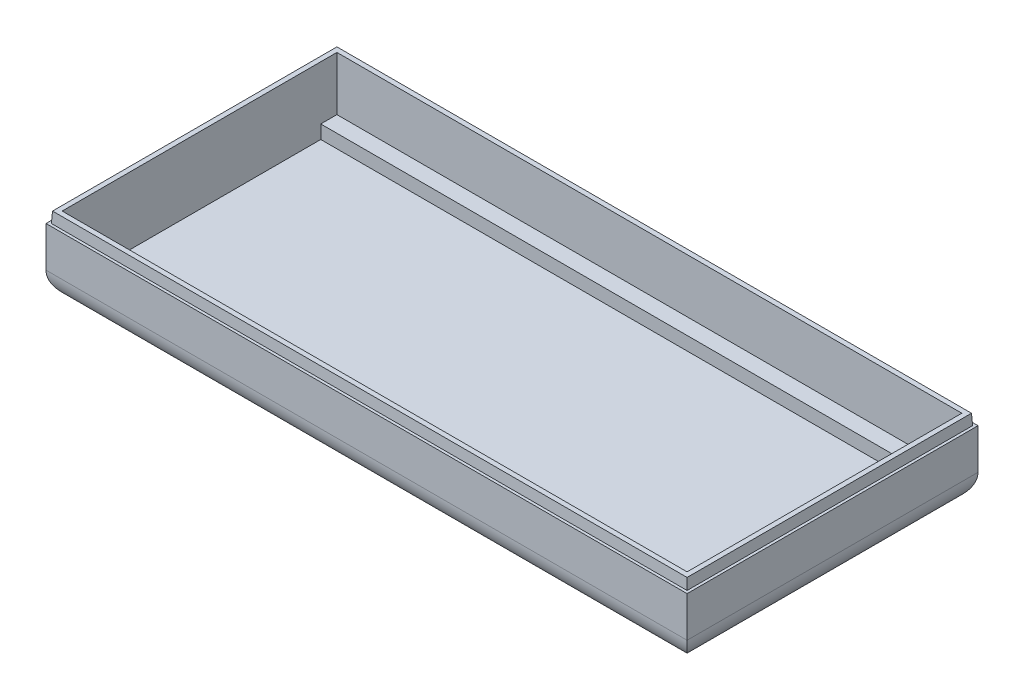
ISO-10303-21;
HEADER;
FILE_DESCRIPTION(('STEP AP214'),'2;1');
FILE_NAME('part.step','',(''),(''),'','','');
FILE_SCHEMA(('AUTOMOTIVE_DESIGN { 1 0 10303 214 1 1 1 1 }'));
ENDSEC;
DATA;
#1=APPLICATION_CONTEXT('core data for automotive mechanical design processes');
#2=APPLICATION_PROTOCOL_DEFINITION('international standard','automotive_design',2000,#1);
#3=PRODUCT_CONTEXT('',#1,'mechanical');
#4=PRODUCT('Part','Part','',(#3));
#5=PRODUCT_RELATED_PRODUCT_CATEGORY('part','',(#4));
#6=PRODUCT_DEFINITION_FORMATION('','',#4);
#7=PRODUCT_DEFINITION_CONTEXT('part definition',#1,'design');
#8=PRODUCT_DEFINITION('design','',#6,#7);
#9=PRODUCT_DEFINITION_SHAPE('','',#8);
#10=(LENGTH_UNIT() NAMED_UNIT(*) SI_UNIT(.MILLI.,.METRE.));
#11=(NAMED_UNIT(*) PLANE_ANGLE_UNIT() SI_UNIT($,.RADIAN.));
#12=(NAMED_UNIT(*) SI_UNIT($,.STERADIAN.) SOLID_ANGLE_UNIT());
#13=UNCERTAINTY_MEASURE_WITH_UNIT(LENGTH_MEASURE(1.E-05),#10,'distance_accuracy_value','');
#14=(GEOMETRIC_REPRESENTATION_CONTEXT(3) GLOBAL_UNCERTAINTY_ASSIGNED_CONTEXT((#13)) GLOBAL_UNIT_ASSIGNED_CONTEXT((#10,
#11,#12)) REPRESENTATION_CONTEXT('',''));
#15=CARTESIAN_POINT('',(0.,0.,0.));
#16=DIRECTION('',(0.,0.,1.));
#17=DIRECTION('',(1.,0.,0.));
#18=AXIS2_PLACEMENT_3D('',#15,#16,#17);
#19=CARTESIAN_POINT('',(0.,0.5,-3.));
#20=DIRECTION('',(1.,0.,0.));
#21=DIRECTION('',(0.,0.,-1.));
#22=AXIS2_PLACEMENT_3D('',#19,#20,#21);
#23=CYLINDRICAL_SURFACE('',#22,5.);
#24=CARTESIAN_POINT('',(112.,0.5,-3.00000000000001));
#25=DIRECTION('',(0.707106781186547,0.,-0.707106781186547));
#26=DIRECTION('',(-0.707106781186548,0.,-0.707106781186547));
#27=AXIS2_PLACEMENT_3D('',#24,#25,#26);
#28=ELLIPSE('',#27,7.07106781186547,5.);
#29=CARTESIAN_POINT('',(117.,0.500000000000001,1.99999999999999));
#30=VERTEX_POINT('',#29);
#31=CARTESIAN_POINT('',(112.,-4.5,-3.00000000000001));
#32=VERTEX_POINT('',#31);
#33=EDGE_CURVE('E12',#30,#32,#28,.T.);
#34=ORIENTED_EDGE('',*,*,#33,.F.);
#35=DIRECTION('',(1.,0.,0.));
#36=VECTOR('',#35,1.);
#37=CARTESIAN_POINT('',(0.,0.5,2.));
#38=LINE('',#37,#36);
#39=CARTESIAN_POINT('',(-1.99999999999999,0.500000000000001,2.));
#40=VERTEX_POINT('',#39);
#41=EDGE_CURVE('E312',#40,#30,#38,.T.);
#42=ORIENTED_EDGE('',*,*,#41,.F.);
#43=CARTESIAN_POINT('',(3.00000000000001,0.5,-3.));
#44=DIRECTION('',(0.707106781186548,0.,0.707106781186547));
#45=DIRECTION('',(0.707106781186547,0.,-0.707106781186548));
#46=AXIS2_PLACEMENT_3D('',#43,#44,#45);
#47=ELLIPSE('',#46,7.07106781186547,5.);
#48=CARTESIAN_POINT('',(3.00000000000001,-4.5,-3.));
#49=VERTEX_POINT('',#48);
#50=EDGE_CURVE('E46',#40,#49,#47,.T.);
#51=ORIENTED_EDGE('',*,*,#50,.T.);
#52=DIRECTION('',(1.,0.,0.));
#53=VECTOR('',#52,1.);
#54=CARTESIAN_POINT('',(0.,-4.5,-3.));
#55=LINE('',#54,#53);
#56=EDGE_CURVE('E294',#32,#49,#55,.F.);
#57=ORIENTED_EDGE('',*,*,#56,.F.);
#58=EDGE_LOOP('',(#34,#42,#51,#57));
#59=FACE_BOUND('',#58,.T.);
#60=ADVANCED_FACE('F39',(#59),#23,.T.);
#61=CARTESIAN_POINT('',(3.00000000000001,0.5,0.));
#62=DIRECTION('',(0.,0.,1.));
#63=DIRECTION('',(1.,0.,0.));
#64=AXIS2_PLACEMENT_3D('',#61,#62,#63);
#65=CYLINDRICAL_SURFACE('',#64,5.);
#66=ORIENTED_EDGE('',*,*,#50,.F.);
#67=DIRECTION('',(0.,0.,1.));
#68=VECTOR('',#67,1.);
#69=CARTESIAN_POINT('',(-1.99999999999999,0.5,0.));
#70=LINE('',#69,#68);
#71=CARTESIAN_POINT('',(-2.,0.500000000000001,-52.));
#72=VERTEX_POINT('',#71);
#73=EDGE_CURVE('E309',#72,#40,#70,.T.);
#74=ORIENTED_EDGE('',*,*,#73,.F.);
#75=CARTESIAN_POINT('',(3.,0.5,-47.));
#76=DIRECTION('',(-0.707106781186547,0.,0.707106781186548));
#77=DIRECTION('',(0.707106781186548,0.,0.707106781186547));
#78=AXIS2_PLACEMENT_3D('',#75,#76,#77);
#79=ELLIPSE('',#78,7.07106781186547,5.);
#80=CARTESIAN_POINT('',(3.,-4.5,-47.));
#81=VERTEX_POINT('',#80);
#82=EDGE_CURVE('E60',#72,#81,#79,.T.);
#83=ORIENTED_EDGE('',*,*,#82,.T.);
#84=DIRECTION('',(0.,0.,1.));
#85=VECTOR('',#84,1.);
#86=CARTESIAN_POINT('',(3.00000000000001,-4.5,0.));
#87=LINE('',#86,#85);
#88=EDGE_CURVE('E297',#49,#81,#87,.F.);
#89=ORIENTED_EDGE('',*,*,#88,.F.);
#90=EDGE_LOOP('',(#66,#74,#83,#89));
#91=FACE_BOUND('',#90,.T.);
#92=ADVANCED_FACE('F319',(#91),#65,.T.);
#93=CARTESIAN_POINT('',(0.,0.5,-47.));
#94=DIRECTION('',(-1.,0.,0.));
#95=DIRECTION('',(0.,0.,1.));
#96=AXIS2_PLACEMENT_3D('',#93,#94,#95);
#97=CYLINDRICAL_SURFACE('',#96,5.);
#98=ORIENTED_EDGE('',*,*,#82,.F.);
#99=DIRECTION('',(-1.,0.,0.));
#100=VECTOR('',#99,1.);
#101=CARTESIAN_POINT('',(0.,0.5,-52.));
#102=LINE('',#101,#100);
#103=CARTESIAN_POINT('',(117.,0.500000000000001,-52.));
#104=VERTEX_POINT('',#103);
#105=EDGE_CURVE('E306',#104,#72,#102,.T.);
#106=ORIENTED_EDGE('',*,*,#105,.F.);
#107=CARTESIAN_POINT('',(112.,0.5,-47.));
#108=DIRECTION('',(-0.707106781186548,0.,-0.707106781186547));
#109=DIRECTION('',(-0.707106781186547,0.,0.707106781186548));
#110=AXIS2_PLACEMENT_3D('',#107,#108,#109);
#111=ELLIPSE('',#110,7.07106781186548,5.);
#112=CARTESIAN_POINT('',(112.,-4.5,-47.));
#113=VERTEX_POINT('',#112);
#114=EDGE_CURVE('E315',#104,#113,#111,.T.);
#115=ORIENTED_EDGE('',*,*,#114,.T.);
#116=DIRECTION('',(-1.,0.,0.));
#117=VECTOR('',#116,1.);
#118=CARTESIAN_POINT('',(0.,-4.5,-47.));
#119=LINE('',#118,#117);
#120=EDGE_CURVE('E300',#81,#113,#119,.F.);
#121=ORIENTED_EDGE('',*,*,#120,.F.);
#122=EDGE_LOOP('',(#98,#106,#115,#121));
#123=FACE_BOUND('',#122,.T.);
#124=ADVANCED_FACE('F342',(#123),#97,.T.);
#125=CARTESIAN_POINT('',(112.,0.5,0.));
#126=DIRECTION('',(0.,0.,-1.));
#127=DIRECTION('',(-1.,0.,0.));
#128=AXIS2_PLACEMENT_3D('',#125,#126,#127);
#129=CYLINDRICAL_SURFACE('',#128,5.);
#130=DIRECTION('',(0.,0.,-1.));
#131=VECTOR('',#130,1.);
#132=CARTESIAN_POINT('',(117.,0.5,0.));
#133=LINE('',#132,#131);
#134=EDGE_CURVE('E291',#30,#104,#133,.T.);
#135=ORIENTED_EDGE('',*,*,#134,.F.);
#136=ORIENTED_EDGE('',*,*,#33,.T.);
#137=DIRECTION('',(0.,0.,-1.));
#138=VECTOR('',#137,1.);
#139=CARTESIAN_POINT('',(112.,-4.5,0.));
#140=LINE('',#139,#138);
#141=EDGE_CURVE('E303',#113,#32,#140,.F.);
#142=ORIENTED_EDGE('',*,*,#141,.F.);
#143=ORIENTED_EDGE('',*,*,#114,.F.);
#144=EDGE_LOOP('',(#135,#136,#142,#143));
#145=FACE_BOUND('',#144,.T.);
#146=ADVANCED_FACE('F325',(#145),#129,.T.);
#147=CARTESIAN_POINT('',(0.,-2.5,2.));
#148=DIRECTION('',(0.,0.,1.));
#149=DIRECTION('',(1.,0.,0.));
#150=AXIS2_PLACEMENT_3D('',#147,#148,#149);
#151=PLANE('',#150);
#152=DIRECTION('',(0.,1.,0.));
#153=VECTOR('',#152,1.);
#154=CARTESIAN_POINT('',(-1.99999999999999,-2.5,2.));
#155=LINE('',#154,#153);
#156=CARTESIAN_POINT('',(-1.99999999999999,8.,2.));
#157=VERTEX_POINT('',#156);
#158=EDGE_CURVE('E277',#40,#157,#155,.T.);
#159=ORIENTED_EDGE('',*,*,#158,.F.);
#160=ORIENTED_EDGE('',*,*,#41,.T.);
#161=DIRECTION('',(0.,1.,0.));
#162=VECTOR('',#161,1.);
#163=CARTESIAN_POINT('',(117.,-2.5,1.99999999999999));
#164=LINE('',#163,#162);
#165=CARTESIAN_POINT('',(117.,8.,1.99999999999999));
#166=VERTEX_POINT('',#165);
#167=EDGE_CURVE('E171',#30,#166,#164,.T.);
#168=ORIENTED_EDGE('',*,*,#167,.T.);
#169=DIRECTION('',(1.,0.,0.));
#170=VECTOR('',#169,1.);
#171=CARTESIAN_POINT('',(0.,8.,2.));
#172=LINE('',#171,#170);
#173=EDGE_CURVE('E260',#157,#166,#172,.T.);
#174=ORIENTED_EDGE('',*,*,#173,.F.);
#175=EDGE_LOOP('',(#159,#160,#168,#174));
#176=FACE_BOUND('',#175,.T.);
#177=ADVANCED_FACE('F329',(#176),#151,.T.);
#178=CARTESIAN_POINT('',(-1.99999999999999,-2.5,0.));
#179=DIRECTION('',(-1.,0.,0.));
#180=DIRECTION('',(0.,0.,1.));
#181=AXIS2_PLACEMENT_3D('',#178,#179,#180);
#182=PLANE('',#181);
#183=DIRECTION('',(0.,1.,0.));
#184=VECTOR('',#183,1.);
#185=CARTESIAN_POINT('',(-2.,-2.5,-52.));
#186=LINE('',#185,#184);
#187=CARTESIAN_POINT('',(-2.,8.,-52.));
#188=VERTEX_POINT('',#187);
#189=EDGE_CURVE('E280',#72,#188,#186,.T.);
#190=ORIENTED_EDGE('',*,*,#189,.F.);
#191=ORIENTED_EDGE('',*,*,#73,.T.);
#192=ORIENTED_EDGE('',*,*,#158,.T.);
#193=DIRECTION('',(0.,0.,1.));
#194=VECTOR('',#193,1.);
#195=CARTESIAN_POINT('',(-1.99999999999999,8.,0.));
#196=LINE('',#195,#194);
#197=EDGE_CURVE('E269',#188,#157,#196,.T.);
#198=ORIENTED_EDGE('',*,*,#197,.F.);
#199=EDGE_LOOP('',(#190,#191,#192,#198));
#200=FACE_BOUND('',#199,.T.);
#201=ADVANCED_FACE('F335',(#200),#182,.T.);
#202=CARTESIAN_POINT('',(0.,-2.5,-52.));
#203=DIRECTION('',(0.,0.,-1.));
#204=DIRECTION('',(-1.,0.,0.));
#205=AXIS2_PLACEMENT_3D('',#202,#203,#204);
#206=PLANE('',#205);
#207=DIRECTION('',(0.,1.,0.));
#208=VECTOR('',#207,1.);
#209=CARTESIAN_POINT('',(117.,-2.5,-52.));
#210=LINE('',#209,#208);
#211=CARTESIAN_POINT('',(117.,8.,-52.));
#212=VERTEX_POINT('',#211);
#213=EDGE_CURVE('E282',#104,#212,#210,.T.);
#214=ORIENTED_EDGE('',*,*,#213,.F.);
#215=ORIENTED_EDGE('',*,*,#105,.T.);
#216=ORIENTED_EDGE('',*,*,#189,.T.);
#217=DIRECTION('',(-1.,0.,0.));
#218=VECTOR('',#217,1.);
#219=CARTESIAN_POINT('',(0.,8.,-52.));
#220=LINE('',#219,#218);
#221=EDGE_CURVE('E266',#212,#188,#220,.T.);
#222=ORIENTED_EDGE('',*,*,#221,.F.);
#223=EDGE_LOOP('',(#214,#215,#216,#222));
#224=FACE_BOUND('',#223,.T.);
#225=ADVANCED_FACE('F341',(#224),#206,.T.);
#226=CARTESIAN_POINT('',(117.,-2.5,0.));
#227=DIRECTION('',(1.,0.,0.));
#228=DIRECTION('',(0.,0.,-1.));
#229=AXIS2_PLACEMENT_3D('',#226,#227,#228);
#230=PLANE('',#229);
#231=ORIENTED_EDGE('',*,*,#167,.F.);
#232=ORIENTED_EDGE('',*,*,#134,.T.);
#233=ORIENTED_EDGE('',*,*,#213,.T.);
#234=DIRECTION('',(0.,0.,-1.));
#235=VECTOR('',#234,1.);
#236=CARTESIAN_POINT('',(117.,8.,0.));
#237=LINE('',#236,#235);
#238=EDGE_CURVE('E263',#166,#212,#237,.T.);
#239=ORIENTED_EDGE('',*,*,#238,.F.);
#240=EDGE_LOOP('',(#231,#232,#233,#239));
#241=FACE_BOUND('',#240,.T.);
#242=ADVANCED_FACE('F344',(#241),#230,.T.);
#243=CARTESIAN_POINT('',(0.,8.,0.));
#244=DIRECTION('',(0.,1.,0.));
#245=DIRECTION('',(0.,0.,1.));
#246=AXIS2_PLACEMENT_3D('',#243,#244,#245);
#247=PLANE('',#246);
#248=DIRECTION('',(0.,0.,1.));
#249=VECTOR('',#248,1.);
#250=CARTESIAN_POINT('',(116.5,8.,0.));
#251=LINE('',#250,#249);
#252=CARTESIAN_POINT('',(116.5,8.,-51.5));
#253=VERTEX_POINT('',#252);
#254=CARTESIAN_POINT('',(116.5,8.,1.5));
#255=VERTEX_POINT('',#254);
#256=EDGE_CURVE('E201',#253,#255,#251,.T.);
#257=ORIENTED_EDGE('',*,*,#256,.T.);
#258=DIRECTION('',(-1.,0.,0.));
#259=VECTOR('',#258,1.);
#260=CARTESIAN_POINT('',(0.,8.,1.5));
#261=LINE('',#260,#259);
#262=CARTESIAN_POINT('',(-1.5,8.,1.5));
#263=VERTEX_POINT('',#262);
#264=EDGE_CURVE('E197',#255,#263,#261,.T.);
#265=ORIENTED_EDGE('',*,*,#264,.T.);
#266=DIRECTION('',(0.,0.,-1.));
#267=VECTOR('',#266,1.);
#268=CARTESIAN_POINT('',(-1.5,8.,0.));
#269=LINE('',#268,#267);
#270=CARTESIAN_POINT('',(-1.5,8.,-51.5));
#271=VERTEX_POINT('',#270);
#272=EDGE_CURVE('E203',#263,#271,#269,.T.);
#273=ORIENTED_EDGE('',*,*,#272,.T.);
#274=DIRECTION('',(1.,0.,0.));
#275=VECTOR('',#274,1.);
#276=CARTESIAN_POINT('',(0.,8.,-51.5));
#277=LINE('',#276,#275);
#278=EDGE_CURVE('E200',#271,#253,#277,.T.);
#279=ORIENTED_EDGE('',*,*,#278,.T.);
#280=EDGE_LOOP('',(#257,#265,#273,#279));
#281=FACE_BOUND('',#280,.T.);
#282=ORIENTED_EDGE('',*,*,#173,.T.);
#283=ORIENTED_EDGE('',*,*,#238,.T.);
#284=ORIENTED_EDGE('',*,*,#221,.T.);
#285=ORIENTED_EDGE('',*,*,#197,.T.);
#286=EDGE_LOOP('',(#282,#283,#284,#285));
#287=FACE_BOUND('',#286,.T.);
#288=ADVANCED_FACE('F337',(#281,#287),#247,.T.);
#289=CARTESIAN_POINT('',(0.,-4.5,0.));
#290=DIRECTION('',(0.,-1.,0.));
#291=DIRECTION('',(0.,0.,-1.));
#292=AXIS2_PLACEMENT_3D('',#289,#290,#291);
#293=PLANE('',#292);
#294=ORIENTED_EDGE('',*,*,#120,.T.);
#295=ORIENTED_EDGE('',*,*,#141,.T.);
#296=ORIENTED_EDGE('',*,*,#56,.T.);
#297=ORIENTED_EDGE('',*,*,#88,.T.);
#298=EDGE_LOOP('',(#294,#295,#296,#297));
#299=FACE_BOUND('',#298,.T.);
#300=ADVANCED_FACE('F321',(#299),#293,.T.);
#301=CARTESIAN_POINT('',(116.5,8.,0.));
#302=DIRECTION('',(0.998629534754574,0.0523359562429438,0.));
#303=DIRECTION('',(-0.0523359562429438,0.998629534754574,0.));
#304=AXIS2_PLACEMENT_3D('',#301,#302,#303);
#305=PLANE('',#304);
#306=ORIENTED_EDGE('',*,*,#256,.F.);
#307=DIRECTION('',(0.0522644276887139,-0.997264688634237,-0.0522644276887139));
#308=VECTOR('',#307,1.);
#309=CARTESIAN_POINT('',(116.18177204821,14.0721510459561,-51.1817720482102));
#310=LINE('',#309,#308);
#311=CARTESIAN_POINT('',(116.395184441434,10.,-51.3951844414339));
#312=VERTEX_POINT('',#311);
#313=EDGE_CURVE('E209',#312,#253,#310,.T.);
#314=ORIENTED_EDGE('',*,*,#313,.F.);
#315=DIRECTION('',(0.,0.,1.));
#316=VECTOR('',#315,1.);
#317=CARTESIAN_POINT('',(116.395184441434,10.,0.));
#318=LINE('',#317,#316);
#319=CARTESIAN_POINT('',(116.395184441434,10.,1.39518444143392));
#320=VERTEX_POINT('',#319);
#321=EDGE_CURVE('E217',#312,#320,#318,.T.);
#322=ORIENTED_EDGE('',*,*,#321,.T.);
#323=DIRECTION('',(0.0522644276887139,-0.997264688634237,0.0522644276887139));
#324=VECTOR('',#323,1.);
#325=CARTESIAN_POINT('',(116.495902644398,8.07818220230845,1.49590264439756));
#326=LINE('',#325,#324);
#327=EDGE_CURVE('E188',#320,#255,#326,.T.);
#328=ORIENTED_EDGE('',*,*,#327,.T.);
#329=EDGE_LOOP('',(#306,#314,#322,#328));
#330=FACE_BOUND('',#329,.T.);
#331=ADVANCED_FACE('F399',(#330),#305,.T.);
#332=CARTESIAN_POINT('',(0.,8.,-51.5));
#333=DIRECTION('',(0.,0.0523359562429438,-0.998629534754574));
#334=DIRECTION('',(0.,0.998629534754574,0.0523359562429438));
#335=AXIS2_PLACEMENT_3D('',#332,#333,#334);
#336=PLANE('',#335);
#337=ORIENTED_EDGE('',*,*,#278,.F.);
#338=DIRECTION('',(-0.0522644276887139,-0.997264688634237,-0.0522644276887139));
#339=VECTOR('',#338,1.);
#340=CARTESIAN_POINT('',(-1.35932412431612,10.68425561259,-51.3593241243161));
#341=LINE('',#340,#339);
#342=CARTESIAN_POINT('',(-1.39518444143392,10.,-51.3951844414339));
#343=VERTEX_POINT('',#342);
#344=EDGE_CURVE('E208',#343,#271,#341,.T.);
#345=ORIENTED_EDGE('',*,*,#344,.F.);
#346=DIRECTION('',(1.,0.,0.));
#347=VECTOR('',#346,1.);
#348=CARTESIAN_POINT('',(0.,10.,-51.3951844414339));
#349=LINE('',#348,#347);
#350=EDGE_CURVE('E216',#343,#312,#349,.T.);
#351=ORIENTED_EDGE('',*,*,#350,.T.);
#352=ORIENTED_EDGE('',*,*,#313,.T.);
#353=EDGE_LOOP('',(#337,#345,#351,#352));
#354=FACE_BOUND('',#353,.T.);
#355=ADVANCED_FACE('F418',(#354),#336,.T.);
#356=CARTESIAN_POINT('',(-1.5,8.,0.));
#357=DIRECTION('',(-0.998629534754574,0.0523359562429438,0.));
#358=DIRECTION('',(-0.0523359562429438,-0.998629534754574,0.));
#359=AXIS2_PLACEMENT_3D('',#356,#357,#358);
#360=PLANE('',#359);
#361=ORIENTED_EDGE('',*,*,#272,.F.);
#362=DIRECTION('',(-0.0522644276887139,-0.997264688634237,0.0522644276887139));
#363=VECTOR('',#362,1.);
#364=CARTESIAN_POINT('',(-1.49590264439756,8.07818220230845,1.49590264439756));
#365=LINE('',#364,#363);
#366=CARTESIAN_POINT('',(-1.39518444143392,10.,1.39518444143392));
#367=VERTEX_POINT('',#366);
#368=EDGE_CURVE('E192',#367,#263,#365,.T.);
#369=ORIENTED_EDGE('',*,*,#368,.F.);
#370=DIRECTION('',(0.,0.,-1.));
#371=VECTOR('',#370,1.);
#372=CARTESIAN_POINT('',(-1.39518444143392,10.,0.));
#373=LINE('',#372,#371);
#374=EDGE_CURVE('E199',#367,#343,#373,.T.);
#375=ORIENTED_EDGE('',*,*,#374,.T.);
#376=ORIENTED_EDGE('',*,*,#344,.T.);
#377=EDGE_LOOP('',(#361,#369,#375,#376));
#378=FACE_BOUND('',#377,.T.);
#379=ADVANCED_FACE('F414',(#378),#360,.T.);
#380=CARTESIAN_POINT('',(0.,8.,1.5));
#381=DIRECTION('',(0.,0.0523359562429438,0.998629534754574));
#382=DIRECTION('',(0.,-0.998629534754574,0.0523359562429438));
#383=AXIS2_PLACEMENT_3D('',#380,#381,#382);
#384=PLANE('',#383);
#385=ORIENTED_EDGE('',*,*,#264,.F.);
#386=ORIENTED_EDGE('',*,*,#327,.F.);
#387=DIRECTION('',(-1.,0.,0.));
#388=VECTOR('',#387,1.);
#389=CARTESIAN_POINT('',(0.,10.,1.39518444143392));
#390=LINE('',#389,#388);
#391=EDGE_CURVE('E182',#320,#367,#390,.T.);
#392=ORIENTED_EDGE('',*,*,#391,.T.);
#393=ORIENTED_EDGE('',*,*,#368,.T.);
#394=EDGE_LOOP('',(#385,#386,#392,#393));
#395=FACE_BOUND('',#394,.T.);
#396=ADVANCED_FACE('F417',(#395),#384,.T.);
#397=CARTESIAN_POINT('',(0.,10.,0.));
#398=DIRECTION('',(0.,1.,0.));
#399=DIRECTION('',(0.,0.,1.));
#400=AXIS2_PLACEMENT_3D('',#397,#398,#399);
#401=PLANE('',#400);
#402=ORIENTED_EDGE('',*,*,#321,.F.);
#403=ORIENTED_EDGE('',*,*,#350,.F.);
#404=ORIENTED_EDGE('',*,*,#374,.F.);
#405=ORIENTED_EDGE('',*,*,#391,.F.);
#406=EDGE_LOOP('',(#402,#403,#404,#405));
#407=FACE_BOUND('',#406,.T.);
#408=DIRECTION('',(0.,0.,-1.));
#409=VECTOR('',#408,1.);
#410=CARTESIAN_POINT('',(115.5,10.,0.));
#411=LINE('',#410,#409);
#412=CARTESIAN_POINT('',(115.5,10.,0.5));
#413=VERTEX_POINT('',#412);
#414=CARTESIAN_POINT('',(115.5,10.,-50.5));
#415=VERTEX_POINT('',#414);
#416=EDGE_CURVE('E179',#413,#415,#411,.T.);
#417=ORIENTED_EDGE('',*,*,#416,.F.);
#418=DIRECTION('',(1.,0.,0.));
#419=VECTOR('',#418,1.);
#420=CARTESIAN_POINT('',(0.,10.,0.5));
#421=LINE('',#420,#419);
#422=CARTESIAN_POINT('',(-0.5,10.,0.5));
#423=VERTEX_POINT('',#422);
#424=EDGE_CURVE('E189',#423,#413,#421,.T.);
#425=ORIENTED_EDGE('',*,*,#424,.F.);
#426=DIRECTION('',(0.,0.,1.));
#427=VECTOR('',#426,1.);
#428=CARTESIAN_POINT('',(-0.5,10.,0.));
#429=LINE('',#428,#427);
#430=CARTESIAN_POINT('',(-0.5,10.,-50.5));
#431=VERTEX_POINT('',#430);
#432=EDGE_CURVE('E181',#431,#423,#429,.T.);
#433=ORIENTED_EDGE('',*,*,#432,.F.);
#434=DIRECTION('',(-1.,0.,0.));
#435=VECTOR('',#434,1.);
#436=CARTESIAN_POINT('',(0.,10.,-50.5));
#437=LINE('',#436,#435);
#438=EDGE_CURVE('E165',#415,#431,#437,.T.);
#439=ORIENTED_EDGE('',*,*,#438,.F.);
#440=EDGE_LOOP('',(#417,#425,#433,#439));
#441=FACE_BOUND('',#440,.T.);
#442=ADVANCED_FACE('F177',(#407,#441),#401,.T.);
#443=CARTESIAN_POINT('',(0.,-2.5,0.));
#444=DIRECTION('',(0.,-1.,0.));
#445=DIRECTION('',(0.,0.,-1.));
#446=AXIS2_PLACEMENT_3D('',#443,#444,#445);
#447=PLANE('',#446);
#448=DIRECTION('',(1.,0.,0.));
#449=VECTOR('',#448,1.);
#450=CARTESIAN_POINT('',(-5.90512483795333,-2.5,-47.5));
#451=LINE('',#450,#449);
#452=CARTESIAN_POINT('',(-0.5,-2.5,-47.5));
#453=VERTEX_POINT('',#452);
#454=CARTESIAN_POINT('',(115.5,-2.5,-47.5));
#455=VERTEX_POINT('',#454);
#456=EDGE_CURVE('E224',#453,#455,#451,.T.);
#457=ORIENTED_EDGE('',*,*,#456,.F.);
#458=DIRECTION('',(0.,0.,1.));
#459=VECTOR('',#458,1.);
#460=CARTESIAN_POINT('',(-0.5,-2.5,0.));
#461=LINE('',#460,#459);
#462=CARTESIAN_POINT('',(-0.5,-2.5,-2.5));
#463=VERTEX_POINT('',#462);
#464=EDGE_CURVE('E275',#453,#463,#461,.T.);
#465=ORIENTED_EDGE('',*,*,#464,.T.);
#466=DIRECTION('',(-1.,0.,0.));
#467=VECTOR('',#466,1.);
#468=CARTESIAN_POINT('',(0.,-2.5,-2.5));
#469=LINE('',#468,#467);
#470=CARTESIAN_POINT('',(115.5,-2.5,-2.5));
#471=VERTEX_POINT('',#470);
#472=EDGE_CURVE('E279',#471,#463,#469,.T.);
#473=ORIENTED_EDGE('',*,*,#472,.F.);
#474=DIRECTION('',(0.,0.,-1.));
#475=VECTOR('',#474,1.);
#476=CARTESIAN_POINT('',(115.5,-2.5,0.));
#477=LINE('',#476,#475);
#478=EDGE_CURVE('E272',#471,#455,#477,.T.);
#479=ORIENTED_EDGE('',*,*,#478,.T.);
#480=EDGE_LOOP('',(#457,#465,#473,#479));
#481=FACE_BOUND('',#480,.T.);
#482=ADVANCED_FACE('F392',(#481),#447,.F.);
#483=CARTESIAN_POINT('',(-5.90512483795333,0.,-2.5));
#484=DIRECTION('',(0.,0.,1.));
#485=DIRECTION('',(0.,-1.,0.));
#486=AXIS2_PLACEMENT_3D('',#483,#484,#485);
#487=PLANE('',#486);
#488=DIRECTION('',(1.,0.,0.));
#489=VECTOR('',#488,1.);
#490=CARTESIAN_POINT('',(-5.90512483795333,0.,-2.5));
#491=LINE('',#490,#489);
#492=CARTESIAN_POINT('',(-0.5,0.,-2.5));
#493=VERTEX_POINT('',#492);
#494=CARTESIAN_POINT('',(115.5,0.,-2.5));
#495=VERTEX_POINT('',#494);
#496=EDGE_CURVE('E245',#493,#495,#491,.T.);
#497=ORIENTED_EDGE('',*,*,#496,.T.);
#498=DIRECTION('',(0.,-1.,0.));
#499=VECTOR('',#498,1.);
#500=CARTESIAN_POINT('',(115.5,-2.5,-2.5));
#501=LINE('',#500,#499);
#502=EDGE_CURVE('E251',#495,#471,#501,.T.);
#503=ORIENTED_EDGE('',*,*,#502,.T.);
#504=ORIENTED_EDGE('',*,*,#472,.T.);
#505=DIRECTION('',(0.,1.,0.));
#506=VECTOR('',#505,1.);
#507=CARTESIAN_POINT('',(-0.5,-2.5,-2.5));
#508=LINE('',#507,#506);
#509=EDGE_CURVE('E248',#463,#493,#508,.T.);
#510=ORIENTED_EDGE('',*,*,#509,.T.);
#511=EDGE_LOOP('',(#497,#503,#504,#510));
#512=FACE_BOUND('',#511,.T.);
#513=ADVANCED_FACE('F395',(#512),#487,.F.);
#514=CARTESIAN_POINT('',(-5.90512483795333,0.,0.5));
#515=DIRECTION('',(0.,-1.,0.));
#516=DIRECTION('',(0.,0.,-1.));
#517=AXIS2_PLACEMENT_3D('',#514,#515,#516);
#518=PLANE('',#517);
#519=DIRECTION('',(1.,0.,0.));
#520=VECTOR('',#519,1.);
#521=CARTESIAN_POINT('',(-5.90512483795333,0.,0.5));
#522=LINE('',#521,#520);
#523=CARTESIAN_POINT('',(-0.5,0.,0.5));
#524=VERTEX_POINT('',#523);
#525=CARTESIAN_POINT('',(115.5,0.,0.5));
#526=VERTEX_POINT('',#525);
#527=EDGE_CURVE('E242',#524,#526,#522,.T.);
#528=ORIENTED_EDGE('',*,*,#527,.T.);
#529=DIRECTION('',(0.,0.,-1.));
#530=VECTOR('',#529,1.);
#531=CARTESIAN_POINT('',(115.5,0.,0.));
#532=LINE('',#531,#530);
#533=EDGE_CURVE('E257',#526,#495,#532,.T.);
#534=ORIENTED_EDGE('',*,*,#533,.T.);
#535=ORIENTED_EDGE('',*,*,#496,.F.);
#536=DIRECTION('',(0.,0.,1.));
#537=VECTOR('',#536,1.);
#538=CARTESIAN_POINT('',(-0.5,0.,0.));
#539=LINE('',#538,#537);
#540=EDGE_CURVE('E254',#493,#524,#539,.T.);
#541=ORIENTED_EDGE('',*,*,#540,.T.);
#542=EDGE_LOOP('',(#528,#534,#535,#541));
#543=FACE_BOUND('',#542,.T.);
#544=ADVANCED_FACE('F400',(#543),#518,.F.);
#545=CARTESIAN_POINT('',(-5.90512483795333,0.,-47.5));
#546=DIRECTION('',(0.,0.,-1.));
#547=DIRECTION('',(-1.,0.,0.));
#548=AXIS2_PLACEMENT_3D('',#545,#546,#547);
#549=PLANE('',#548);
#550=ORIENTED_EDGE('',*,*,#456,.T.);
#551=DIRECTION('',(0.,1.,0.));
#552=VECTOR('',#551,1.);
#553=CARTESIAN_POINT('',(115.5,-2.5,-47.5));
#554=LINE('',#553,#552);
#555=CARTESIAN_POINT('',(115.5,0.,-47.5));
#556=VERTEX_POINT('',#555);
#557=EDGE_CURVE('E239',#455,#556,#554,.T.);
#558=ORIENTED_EDGE('',*,*,#557,.T.);
#559=DIRECTION('',(1.,0.,0.));
#560=VECTOR('',#559,1.);
#561=CARTESIAN_POINT('',(-5.90512483795333,0.,-47.5));
#562=LINE('',#561,#560);
#563=CARTESIAN_POINT('',(-0.5,0.,-47.5));
#564=VERTEX_POINT('',#563);
#565=EDGE_CURVE('E227',#564,#556,#562,.T.);
#566=ORIENTED_EDGE('',*,*,#565,.F.);
#567=DIRECTION('',(0.,-1.,0.));
#568=VECTOR('',#567,1.);
#569=CARTESIAN_POINT('',(-0.5,-2.5,-47.5));
#570=LINE('',#569,#568);
#571=EDGE_CURVE('E236',#564,#453,#570,.T.);
#572=ORIENTED_EDGE('',*,*,#571,.T.);
#573=EDGE_LOOP('',(#550,#558,#566,#572));
#574=FACE_BOUND('',#573,.T.);
#575=ADVANCED_FACE('F403',(#574),#549,.F.);
#576=CARTESIAN_POINT('',(-5.90512483795333,0.,-50.5));
#577=DIRECTION('',(0.,-1.,0.));
#578=DIRECTION('',(0.,0.,-1.));
#579=AXIS2_PLACEMENT_3D('',#576,#577,#578);
#580=PLANE('',#579);
#581=ORIENTED_EDGE('',*,*,#565,.T.);
#582=DIRECTION('',(0.,0.,-1.));
#583=VECTOR('',#582,1.);
#584=CARTESIAN_POINT('',(115.5,0.,0.));
#585=LINE('',#584,#583);
#586=CARTESIAN_POINT('',(115.5,0.,-50.5));
#587=VERTEX_POINT('',#586);
#588=EDGE_CURVE('E234',#556,#587,#585,.T.);
#589=ORIENTED_EDGE('',*,*,#588,.T.);
#590=DIRECTION('',(1.,0.,0.));
#591=VECTOR('',#590,1.);
#592=CARTESIAN_POINT('',(-5.90512483795333,0.,-50.5));
#593=LINE('',#592,#591);
#594=CARTESIAN_POINT('',(-0.5,0.,-50.5));
#595=VERTEX_POINT('',#594);
#596=EDGE_CURVE('E167',#595,#587,#593,.T.);
#597=ORIENTED_EDGE('',*,*,#596,.F.);
#598=DIRECTION('',(0.,0.,1.));
#599=VECTOR('',#598,1.);
#600=CARTESIAN_POINT('',(-0.5,0.,0.));
#601=LINE('',#600,#599);
#602=EDGE_CURVE('E230',#595,#564,#601,.T.);
#603=ORIENTED_EDGE('',*,*,#602,.T.);
#604=EDGE_LOOP('',(#581,#589,#597,#603));
#605=FACE_BOUND('',#604,.T.);
#606=ADVANCED_FACE('F380',(#605),#580,.F.);
#607=CARTESIAN_POINT('',(0.,-2.5,-50.5));
#608=DIRECTION('',(0.,0.,-1.));
#609=DIRECTION('',(-1.,0.,0.));
#610=AXIS2_PLACEMENT_3D('',#607,#608,#609);
#611=PLANE('',#610);
#612=ORIENTED_EDGE('',*,*,#596,.T.);
#613=DIRECTION('',(0.,1.,0.));
#614=VECTOR('',#613,1.);
#615=CARTESIAN_POINT('',(115.5,-2.5,-50.5));
#616=LINE('',#615,#614);
#617=EDGE_CURVE('E162',#587,#415,#616,.T.);
#618=ORIENTED_EDGE('',*,*,#617,.T.);
#619=ORIENTED_EDGE('',*,*,#438,.T.);
#620=DIRECTION('',(0.,1.,0.));
#621=VECTOR('',#620,1.);
#622=CARTESIAN_POINT('',(-0.5,-2.5,-50.5));
#623=LINE('',#622,#621);
#624=EDGE_CURVE('E172',#595,#431,#623,.T.);
#625=ORIENTED_EDGE('',*,*,#624,.F.);
#626=EDGE_LOOP('',(#612,#618,#619,#625));
#627=FACE_BOUND('',#626,.T.);
#628=ADVANCED_FACE('F164',(#627),#611,.F.);
#629=CARTESIAN_POINT('',(-0.5,-2.5,0.));
#630=DIRECTION('',(-1.,0.,0.));
#631=DIRECTION('',(0.,0.,1.));
#632=AXIS2_PLACEMENT_3D('',#629,#630,#631);
#633=PLANE('',#632);
#634=ORIENTED_EDGE('',*,*,#571,.F.);
#635=ORIENTED_EDGE('',*,*,#602,.F.);
#636=ORIENTED_EDGE('',*,*,#624,.T.);
#637=ORIENTED_EDGE('',*,*,#432,.T.);
#638=DIRECTION('',(0.,1.,0.));
#639=VECTOR('',#638,1.);
#640=CARTESIAN_POINT('',(-0.5,-2.5,0.5));
#641=LINE('',#640,#639);
#642=EDGE_CURVE('E286',#524,#423,#641,.T.);
#643=ORIENTED_EDGE('',*,*,#642,.F.);
#644=ORIENTED_EDGE('',*,*,#540,.F.);
#645=ORIENTED_EDGE('',*,*,#509,.F.);
#646=ORIENTED_EDGE('',*,*,#464,.F.);
#647=EDGE_LOOP('',(#634,#635,#636,#637,#643,#644,#645,#646));
#648=FACE_BOUND('',#647,.T.);
#649=ADVANCED_FACE('F374',(#648),#633,.F.);
#650=CARTESIAN_POINT('',(0.,-2.5,0.5));
#651=DIRECTION('',(0.,0.,1.));
#652=DIRECTION('',(1.,0.,0.));
#653=AXIS2_PLACEMENT_3D('',#650,#651,#652);
#654=PLANE('',#653);
#655=ORIENTED_EDGE('',*,*,#527,.F.);
#656=ORIENTED_EDGE('',*,*,#642,.T.);
#657=ORIENTED_EDGE('',*,*,#424,.T.);
#658=DIRECTION('',(0.,1.,0.));
#659=VECTOR('',#658,1.);
#660=CARTESIAN_POINT('',(115.5,-2.5,0.5));
#661=LINE('',#660,#659);
#662=EDGE_CURVE('E186',#526,#413,#661,.T.);
#663=ORIENTED_EDGE('',*,*,#662,.F.);
#664=EDGE_LOOP('',(#655,#656,#657,#663));
#665=FACE_BOUND('',#664,.T.);
#666=ADVANCED_FACE('F371',(#665),#654,.F.);
#667=CARTESIAN_POINT('',(115.5,-2.5,0.));
#668=DIRECTION('',(1.,0.,0.));
#669=DIRECTION('',(0.,0.,-1.));
#670=AXIS2_PLACEMENT_3D('',#667,#668,#669);
#671=PLANE('',#670);
#672=ORIENTED_EDGE('',*,*,#557,.F.);
#673=ORIENTED_EDGE('',*,*,#478,.F.);
#674=ORIENTED_EDGE('',*,*,#502,.F.);
#675=ORIENTED_EDGE('',*,*,#533,.F.);
#676=ORIENTED_EDGE('',*,*,#662,.T.);
#677=ORIENTED_EDGE('',*,*,#416,.T.);
#678=ORIENTED_EDGE('',*,*,#617,.F.);
#679=ORIENTED_EDGE('',*,*,#588,.F.);
#680=EDGE_LOOP('',(#672,#673,#674,#675,#676,#677,#678,#679));
#681=FACE_BOUND('',#680,.T.);
#682=ADVANCED_FACE('F184',(#681),#671,.F.);
#683=CLOSED_SHELL('',(#60,#92,#124,#146,#177,#201,#225,#242,#288,#300,#331,#355,#379,#396,#442,
#482,#513,#544,#575,#606,#628,#649,#666,#682));
#684=MANIFOLD_SOLID_BREP('B2',#683);
#685=ADVANCED_BREP_SHAPE_REPRESENTATION('',(#18,#684),#14);
#686=SHAPE_DEFINITION_REPRESENTATION(#9,#685);
ENDSEC;
END-ISO-10303-21;
